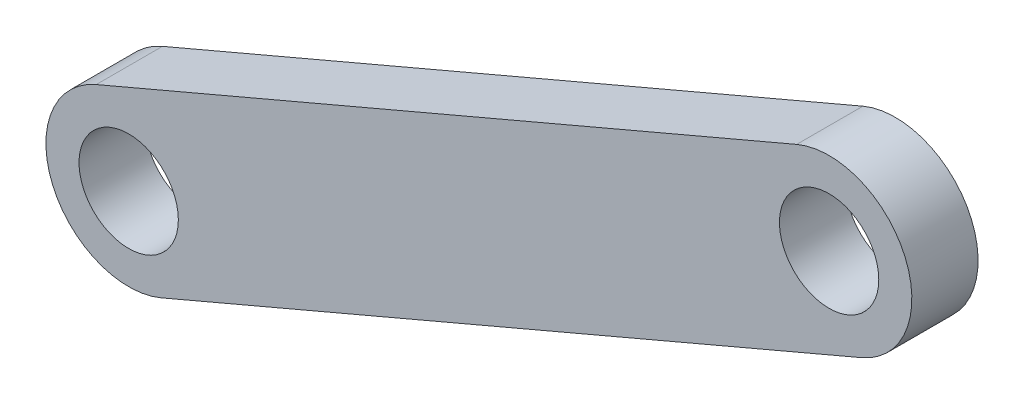
ISO-10303-21;
HEADER;
FILE_DESCRIPTION(('STEP AP214'),'2;1');
FILE_NAME('part.step','',(''),(''),'','','');
FILE_SCHEMA(('AUTOMOTIVE_DESIGN { 1 0 10303 214 1 1 1 1 }'));
ENDSEC;
DATA;
#1=APPLICATION_CONTEXT('core data for automotive mechanical design processes');
#2=APPLICATION_PROTOCOL_DEFINITION('international standard','automotive_design',2000,#1);
#3=PRODUCT_CONTEXT('',#1,'mechanical');
#4=PRODUCT('Part','Part','',(#3));
#5=PRODUCT_RELATED_PRODUCT_CATEGORY('part','',(#4));
#6=PRODUCT_DEFINITION_FORMATION('','',#4);
#7=PRODUCT_DEFINITION_CONTEXT('part definition',#1,'design');
#8=PRODUCT_DEFINITION('design','',#6,#7);
#9=PRODUCT_DEFINITION_SHAPE('','',#8);
#10=(LENGTH_UNIT() NAMED_UNIT(*) SI_UNIT(.MILLI.,.METRE.));
#11=(NAMED_UNIT(*) PLANE_ANGLE_UNIT() SI_UNIT($,.RADIAN.));
#12=(NAMED_UNIT(*) SI_UNIT($,.STERADIAN.) SOLID_ANGLE_UNIT());
#13=UNCERTAINTY_MEASURE_WITH_UNIT(LENGTH_MEASURE(1.E-05),#10,'distance_accuracy_value','');
#14=(GEOMETRIC_REPRESENTATION_CONTEXT(3) GLOBAL_UNCERTAINTY_ASSIGNED_CONTEXT((#13)) GLOBAL_UNIT_ASSIGNED_CONTEXT((#10,
#11,#12)) REPRESENTATION_CONTEXT('',''));
#15=CARTESIAN_POINT('',(0.,0.,0.));
#16=DIRECTION('',(0.,0.,1.));
#17=DIRECTION('',(1.,0.,0.));
#18=AXIS2_PLACEMENT_3D('',#15,#16,#17);
#19=CARTESIAN_POINT('',(0.823046409348874,-1.93195971718526,-2.));
#20=DIRECTION('',(0.391932472189587,-0.919993987612614,0.));
#21=DIRECTION('',(0.919993987612614,0.391932472189587,0.));
#22=AXIS2_PLACEMENT_3D('',#19,#20,#21);
#23=PLANE('',#22);
#24=DIRECTION('',(-0.919993987612614,-0.391932472189587,0.));
#25=VECTOR('',#24,1.);
#26=CARTESIAN_POINT('',(0.823046409348874,-1.93195971718526,-4.));
#27=LINE('',#26,#25);
#28=CARTESIAN_POINT('',(-0.979831180473966,-2.70001503096847,-4.));
#29=VERTEX_POINT('',#28);
#30=CARTESIAN_POINT('',(-22.1396928955641,-11.714461891329,-4.));
#31=VERTEX_POINT('',#30);
#32=EDGE_CURVE('E101',#29,#31,#27,.T.);
#33=ORIENTED_EDGE('',*,*,#32,.T.);
#34=DIRECTION('',(0.,0.,-1.));
#35=VECTOR('',#34,1.);
#36=CARTESIAN_POINT('',(-22.1396928955641,-11.714461891329,-2.));
#37=LINE('',#36,#35);
#38=CARTESIAN_POINT('',(-22.1396928955641,-11.714461891329,-2.));
#39=VERTEX_POINT('',#38);
#40=EDGE_CURVE('E11',#39,#31,#37,.T.);
#41=ORIENTED_EDGE('',*,*,#40,.F.);
#42=DIRECTION('',(-0.919993987612614,-0.391932472189587,0.));
#43=VECTOR('',#42,1.);
#44=CARTESIAN_POINT('',(0.823046409348874,-1.93195971718526,-2.));
#45=LINE('',#44,#43);
#46=CARTESIAN_POINT('',(-0.979831180473966,-2.70001503096847,-2.));
#47=VERTEX_POINT('',#46);
#48=EDGE_CURVE('E86',#47,#39,#45,.T.);
#49=ORIENTED_EDGE('',*,*,#48,.F.);
#50=DIRECTION('',(0.,0.,-1.));
#51=VECTOR('',#50,1.);
#52=CARTESIAN_POINT('',(-0.979831180473966,-2.70001503096847,-2.));
#53=LINE('',#52,#51);
#54=EDGE_CURVE('E97',#47,#29,#53,.T.);
#55=ORIENTED_EDGE('',*,*,#54,.T.);
#56=EDGE_LOOP('',(#33,#41,#49,#55));
#57=FACE_BOUND('',#56,.T.);
#58=ADVANCED_FACE('F39',(#57),#23,.F.);
#59=CARTESIAN_POINT('',(-21.1598617150901,-14.0144468603605,-2.));
#60=DIRECTION('',(0.,0.,-1.));
#61=DIRECTION('',(-1.,0.,0.));
#62=AXIS2_PLACEMENT_3D('',#59,#60,#61);
#63=CYLINDRICAL_SURFACE('',#62,2.5);
#64=CARTESIAN_POINT('',(-21.1598617150901,-14.0144468603605,-4.));
#65=DIRECTION('',(0.,0.,1.));
#66=DIRECTION('',(1.,0.,0.));
#67=AXIS2_PLACEMENT_3D('',#64,#65,#66);
#68=CIRCLE('',#67,2.5);
#69=CARTESIAN_POINT('',(-20.1800305346162,-16.314431829392,-4.));
#70=VERTEX_POINT('',#69);
#71=EDGE_CURVE('E91',#31,#70,#68,.T.);
#72=ORIENTED_EDGE('',*,*,#71,.T.);
#73=DIRECTION('',(0.,0.,-1.));
#74=VECTOR('',#73,1.);
#75=CARTESIAN_POINT('',(-20.1800305346162,-16.314431829392,-2.));
#76=LINE('',#75,#74);
#77=CARTESIAN_POINT('',(-20.1800305346162,-16.314431829392,-2.));
#78=VERTEX_POINT('',#77);
#79=EDGE_CURVE('E47',#78,#70,#76,.T.);
#80=ORIENTED_EDGE('',*,*,#79,.F.);
#81=CARTESIAN_POINT('',(-21.1598617150901,-14.0144468603605,-2.));
#82=DIRECTION('',(0.,0.,1.));
#83=DIRECTION('',(1.,0.,0.));
#84=AXIS2_PLACEMENT_3D('',#81,#82,#83);
#85=CIRCLE('',#84,2.5);
#86=EDGE_CURVE('E81',#39,#78,#85,.T.);
#87=ORIENTED_EDGE('',*,*,#86,.F.);
#88=ORIENTED_EDGE('',*,*,#40,.T.);
#89=EDGE_LOOP('',(#72,#80,#87,#88));
#90=FACE_BOUND('',#89,.T.);
#91=ADVANCED_FACE('F90',(#90),#63,.T.);
#92=CARTESIAN_POINT('',(2.78270877029681,-6.53192965524832,-2.));
#93=DIRECTION('',(0.391932472189587,-0.919993987612614,0.));
#94=DIRECTION('',(0.919993987612614,0.391932472189587,0.));
#95=AXIS2_PLACEMENT_3D('',#92,#93,#94);
#96=PLANE('',#95);
#97=DIRECTION('',(-0.919993987612614,-0.391932472189587,0.));
#98=VECTOR('',#97,1.);
#99=CARTESIAN_POINT('',(2.78270877029681,-6.53192965524832,-4.));
#100=LINE('',#99,#98);
#101=CARTESIAN_POINT('',(0.979831180473965,-7.29998496903153,-4.));
#102=VERTEX_POINT('',#101);
#103=EDGE_CURVE('E106',#102,#70,#100,.T.);
#104=ORIENTED_EDGE('',*,*,#103,.F.);
#105=DIRECTION('',(0.,0.,-1.));
#106=VECTOR('',#105,1.);
#107=CARTESIAN_POINT('',(0.979831180473965,-7.29998496903153,-2.));
#108=LINE('',#107,#106);
#109=CARTESIAN_POINT('',(0.979831180473965,-7.29998496903153,-2.));
#110=VERTEX_POINT('',#109);
#111=EDGE_CURVE('E71',#110,#102,#108,.T.);
#112=ORIENTED_EDGE('',*,*,#111,.F.);
#113=DIRECTION('',(-0.919993987612614,-0.391932472189587,0.));
#114=VECTOR('',#113,1.);
#115=CARTESIAN_POINT('',(2.78270877029681,-6.53192965524832,-2.));
#116=LINE('',#115,#114);
#117=EDGE_CURVE('E84',#110,#78,#116,.T.);
#118=ORIENTED_EDGE('',*,*,#117,.T.);
#119=ORIENTED_EDGE('',*,*,#79,.T.);
#120=EDGE_LOOP('',(#104,#112,#118,#119));
#121=FACE_BOUND('',#120,.T.);
#122=ADVANCED_FACE('F95',(#121),#96,.T.);
#123=CARTESIAN_POINT('',(0.,-5.,-2.));
#124=DIRECTION('',(0.,0.,-1.));
#125=DIRECTION('',(-1.,0.,0.));
#126=AXIS2_PLACEMENT_3D('',#123,#124,#125);
#127=CYLINDRICAL_SURFACE('',#126,2.5);
#128=CARTESIAN_POINT('',(0.,-5.,-4.));
#129=DIRECTION('',(0.,0.,1.));
#130=DIRECTION('',(1.,0.,0.));
#131=AXIS2_PLACEMENT_3D('',#128,#129,#130);
#132=CIRCLE('',#131,2.5);
#133=EDGE_CURVE('E74',#102,#29,#132,.T.);
#134=ORIENTED_EDGE('',*,*,#133,.T.);
#135=ORIENTED_EDGE('',*,*,#54,.F.);
#136=CARTESIAN_POINT('',(0.,-5.,-2.));
#137=DIRECTION('',(0.,0.,1.));
#138=DIRECTION('',(1.,0.,0.));
#139=AXIS2_PLACEMENT_3D('',#136,#137,#138);
#140=CIRCLE('',#139,2.5);
#141=EDGE_CURVE('E55',#110,#47,#140,.T.);
#142=ORIENTED_EDGE('',*,*,#141,.F.);
#143=ORIENTED_EDGE('',*,*,#111,.T.);
#144=EDGE_LOOP('',(#134,#135,#142,#143));
#145=FACE_BOUND('',#144,.T.);
#146=ADVANCED_FACE('F125',(#145),#127,.T.);
#147=CARTESIAN_POINT('',(0.,0.,-2.));
#148=DIRECTION('',(0.,0.,1.));
#149=DIRECTION('',(1.,0.,0.));
#150=AXIS2_PLACEMENT_3D('',#147,#148,#149);
#151=PLANE('',#150);
#152=CARTESIAN_POINT('',(-21.1598617150901,-14.0144468603605,-2.));
#153=DIRECTION('',(0.,0.,1.));
#154=DIRECTION('',(1.,0.,0.));
#155=AXIS2_PLACEMENT_3D('',#152,#153,#154);
#156=CIRCLE('',#155,1.5);
#157=CARTESIAN_POINT('',(-19.6598617150901,-14.0144468603605,-2.));
#158=VERTEX_POINT('',#157);
#159=EDGE_CURVE('E223',#158,#158,#156,.T.);
#160=ORIENTED_EDGE('',*,*,#159,.F.);
#161=EDGE_LOOP('',(#160));
#162=FACE_BOUND('',#161,.T.);
#163=CARTESIAN_POINT('',(0.,-5.,-2.));
#164=DIRECTION('',(0.,0.,1.));
#165=DIRECTION('',(1.,0.,0.));
#166=AXIS2_PLACEMENT_3D('',#163,#164,#165);
#167=CIRCLE('',#166,1.5);
#168=CARTESIAN_POINT('',(1.5,-5.,-2.));
#169=VERTEX_POINT('',#168);
#170=EDGE_CURVE('E224',#169,#169,#167,.T.);
#171=ORIENTED_EDGE('',*,*,#170,.F.);
#172=EDGE_LOOP('',(#171));
#173=FACE_BOUND('',#172,.T.);
#174=ORIENTED_EDGE('',*,*,#48,.T.);
#175=ORIENTED_EDGE('',*,*,#86,.T.);
#176=ORIENTED_EDGE('',*,*,#117,.F.);
#177=ORIENTED_EDGE('',*,*,#141,.T.);
#178=EDGE_LOOP('',(#174,#175,#176,#177));
#179=FACE_BOUND('',#178,.T.);
#180=ADVANCED_FACE('F82',(#162,#173,#179),#151,.T.);
#181=CARTESIAN_POINT('',(0.,0.,-4.));
#182=DIRECTION('',(0.,0.,1.));
#183=DIRECTION('',(1.,0.,0.));
#184=AXIS2_PLACEMENT_3D('',#181,#182,#183);
#185=PLANE('',#184);
#186=CARTESIAN_POINT('',(-21.1598617150901,-14.0144468603605,-4.));
#187=DIRECTION('',(0.,0.,1.));
#188=DIRECTION('',(1.,0.,0.));
#189=AXIS2_PLACEMENT_3D('',#186,#187,#188);
#190=CIRCLE('',#189,1.5);
#191=CARTESIAN_POINT('',(-19.6598617150901,-14.0144468603605,-4.));
#192=VERTEX_POINT('',#191);
#193=EDGE_CURVE('E104',#192,#192,#190,.T.);
#194=ORIENTED_EDGE('',*,*,#193,.T.);
#195=EDGE_LOOP('',(#194));
#196=FACE_BOUND('',#195,.T.);
#197=CARTESIAN_POINT('',(0.,-5.,-4.));
#198=DIRECTION('',(0.,0.,1.));
#199=DIRECTION('',(1.,0.,0.));
#200=AXIS2_PLACEMENT_3D('',#197,#198,#199);
#201=CIRCLE('',#200,1.5);
#202=CARTESIAN_POINT('',(1.5,-5.,-4.));
#203=VERTEX_POINT('',#202);
#204=EDGE_CURVE('E228',#203,#203,#201,.T.);
#205=ORIENTED_EDGE('',*,*,#204,.T.);
#206=EDGE_LOOP('',(#205));
#207=FACE_BOUND('',#206,.T.);
#208=ORIENTED_EDGE('',*,*,#32,.F.);
#209=ORIENTED_EDGE('',*,*,#133,.F.);
#210=ORIENTED_EDGE('',*,*,#103,.T.);
#211=ORIENTED_EDGE('',*,*,#71,.F.);
#212=EDGE_LOOP('',(#208,#209,#210,#211));
#213=FACE_BOUND('',#212,.T.);
#214=ADVANCED_FACE('F113',(#196,#207,#213),#185,.F.);
#215=CARTESIAN_POINT('',(0.,-5.,-4.));
#216=DIRECTION('',(0.,0.,1.));
#217=DIRECTION('',(1.,0.,0.));
#218=AXIS2_PLACEMENT_3D('',#215,#216,#217);
#219=CYLINDRICAL_SURFACE('',#218,1.5);
#220=ORIENTED_EDGE('',*,*,#204,.F.);
#221=EDGE_LOOP('',(#220));
#222=FACE_BOUND('',#221,.T.);
#223=ORIENTED_EDGE('',*,*,#170,.T.);
#224=EDGE_LOOP('',(#223));
#225=FACE_BOUND('',#224,.T.);
#226=ADVANCED_FACE('F115',(#222,#225),#219,.F.);
#227=CARTESIAN_POINT('',(-21.1598617150901,-14.0144468603605,-4.));
#228=DIRECTION('',(0.,0.,1.));
#229=DIRECTION('',(1.,0.,0.));
#230=AXIS2_PLACEMENT_3D('',#227,#228,#229);
#231=CYLINDRICAL_SURFACE('',#230,1.5);
#232=ORIENTED_EDGE('',*,*,#193,.F.);
#233=EDGE_LOOP('',(#232));
#234=FACE_BOUND('',#233,.T.);
#235=ORIENTED_EDGE('',*,*,#159,.T.);
#236=EDGE_LOOP('',(#235));
#237=FACE_BOUND('',#236,.T.);
#238=ADVANCED_FACE('F122',(#234,#237),#231,.F.);
#239=CLOSED_SHELL('',(#58,#91,#122,#146,#180,#214,#226,#238));
#240=MANIFOLD_SOLID_BREP('B2',#239);
#241=ADVANCED_BREP_SHAPE_REPRESENTATION('',(#18,#240),#14);
#242=SHAPE_DEFINITION_REPRESENTATION(#9,#241);
ENDSEC;
END-ISO-10303-21;
